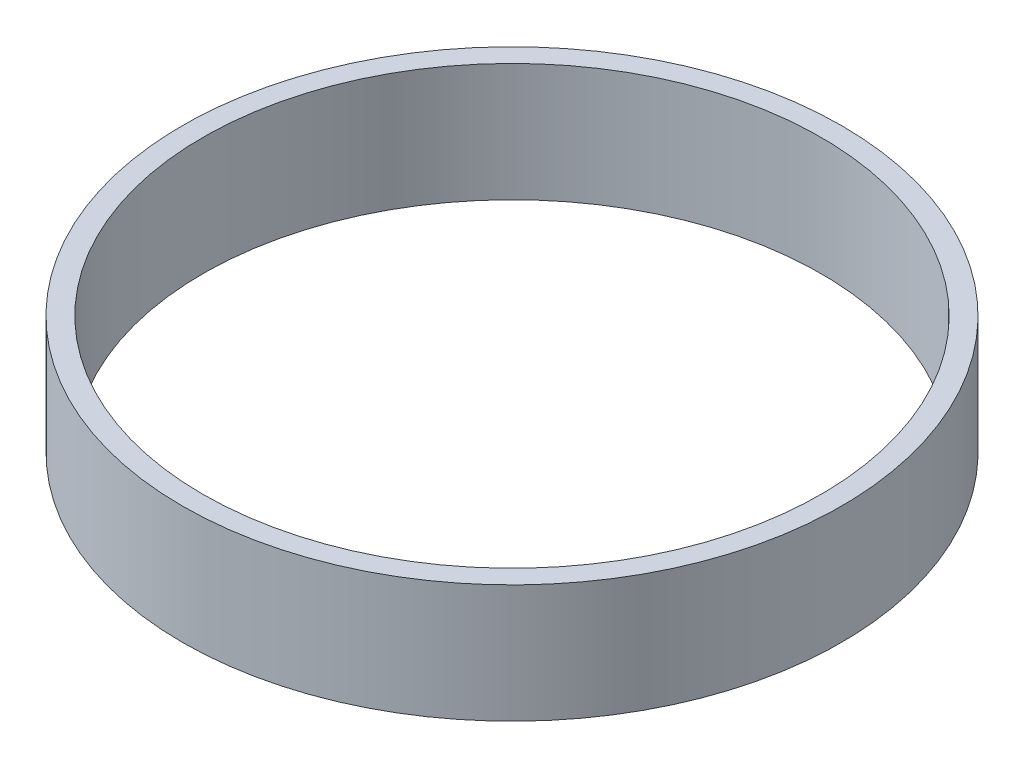
ISO-10303-21;
HEADER;
FILE_DESCRIPTION(('STEP AP214'),'2;1');
FILE_NAME('part.step','',(''),(''),'','','');
FILE_SCHEMA(('AUTOMOTIVE_DESIGN { 1 0 10303 214 1 1 1 1 }'));
ENDSEC;
DATA;
#1=APPLICATION_CONTEXT('core data for automotive mechanical design processes');
#2=APPLICATION_PROTOCOL_DEFINITION('international standard','automotive_design',2000,#1);
#3=PRODUCT_CONTEXT('',#1,'mechanical');
#4=PRODUCT('Part','Part','',(#3));
#5=PRODUCT_RELATED_PRODUCT_CATEGORY('part','',(#4));
#6=PRODUCT_DEFINITION_FORMATION('','',#4);
#7=PRODUCT_DEFINITION_CONTEXT('part definition',#1,'design');
#8=PRODUCT_DEFINITION('design','',#6,#7);
#9=PRODUCT_DEFINITION_SHAPE('','',#8);
#10=(LENGTH_UNIT() NAMED_UNIT(*) SI_UNIT(.MILLI.,.METRE.));
#11=(NAMED_UNIT(*) PLANE_ANGLE_UNIT() SI_UNIT($,.RADIAN.));
#12=(NAMED_UNIT(*) SI_UNIT($,.STERADIAN.) SOLID_ANGLE_UNIT());
#13=UNCERTAINTY_MEASURE_WITH_UNIT(LENGTH_MEASURE(1.E-05),#10,'distance_accuracy_value','');
#14=(GEOMETRIC_REPRESENTATION_CONTEXT(3) GLOBAL_UNCERTAINTY_ASSIGNED_CONTEXT((#13)) GLOBAL_UNIT_ASSIGNED_CONTEXT((#10,
#11,#12)) REPRESENTATION_CONTEXT('',''));
#15=CARTESIAN_POINT('',(0.,0.,0.));
#16=DIRECTION('',(0.,0.,1.));
#17=DIRECTION('',(1.,0.,0.));
#18=AXIS2_PLACEMENT_3D('',#15,#16,#17);
#19=CARTESIAN_POINT('',(0.,13.65,0.));
#20=DIRECTION('',(0.,1.,0.));
#21=DIRECTION('',(0.,0.,1.));
#22=AXIS2_PLACEMENT_3D('',#19,#20,#21);
#23=PLANE('',#22);
#24=CARTESIAN_POINT('',(0.,13.65,0.));
#25=DIRECTION('',(0.,1.,0.));
#26=DIRECTION('',(0.,0.,1.));
#27=AXIS2_PLACEMENT_3D('',#24,#25,#26);
#28=CIRCLE('',#27,38.1);
#29=CARTESIAN_POINT('',(0.,13.65,38.1));
#30=VERTEX_POINT('',#29);
#31=EDGE_CURVE('E10',#30,#30,#28,.T.);
#32=ORIENTED_EDGE('',*,*,#31,.T.);
#33=EDGE_LOOP('',(#32));
#34=FACE_BOUND('',#33,.T.);
#35=CARTESIAN_POINT('',(0.,13.65,0.));
#36=DIRECTION('',(0.,1.,0.));
#37=DIRECTION('',(0.,0.,1.));
#38=AXIS2_PLACEMENT_3D('',#35,#36,#37);
#39=CIRCLE('',#38,35.74);
#40=CARTESIAN_POINT('',(0.,13.65,35.74));
#41=VERTEX_POINT('',#40);
#42=EDGE_CURVE('E54',#41,#41,#39,.T.);
#43=ORIENTED_EDGE('',*,*,#42,.F.);
#44=EDGE_LOOP('',(#43));
#45=FACE_BOUND('',#44,.T.);
#46=ADVANCED_FACE('F41',(#34,#45),#23,.T.);
#47=CARTESIAN_POINT('',(0.,0.,0.));
#48=DIRECTION('',(0.,1.,0.));
#49=DIRECTION('',(0.,0.,1.));
#50=AXIS2_PLACEMENT_3D('',#47,#48,#49);
#51=PLANE('',#50);
#52=CARTESIAN_POINT('',(0.,0.,0.));
#53=DIRECTION('',(0.,1.,0.));
#54=DIRECTION('',(0.,0.,1.));
#55=AXIS2_PLACEMENT_3D('',#52,#53,#54);
#56=CIRCLE('',#55,38.1);
#57=CARTESIAN_POINT('',(0.,0.,38.1));
#58=VERTEX_POINT('',#57);
#59=EDGE_CURVE('E45',#58,#58,#56,.T.);
#60=ORIENTED_EDGE('',*,*,#59,.F.);
#61=EDGE_LOOP('',(#60));
#62=FACE_BOUND('',#61,.T.);
#63=CARTESIAN_POINT('',(0.,0.,0.));
#64=DIRECTION('',(0.,1.,0.));
#65=DIRECTION('',(0.,0.,1.));
#66=AXIS2_PLACEMENT_3D('',#63,#64,#65);
#67=CIRCLE('',#66,35.74);
#68=CARTESIAN_POINT('',(0.,0.,35.74));
#69=VERTEX_POINT('',#68);
#70=EDGE_CURVE('E56',#69,#69,#67,.T.);
#71=ORIENTED_EDGE('',*,*,#70,.T.);
#72=EDGE_LOOP('',(#71));
#73=FACE_BOUND('',#72,.T.);
#74=ADVANCED_FACE('F68',(#62,#73),#51,.F.);
#75=CARTESIAN_POINT('',(0.,13.65,0.));
#76=DIRECTION('',(0.,-1.,0.));
#77=DIRECTION('',(0.,0.,-1.));
#78=AXIS2_PLACEMENT_3D('',#75,#76,#77);
#79=CYLINDRICAL_SURFACE('',#78,38.1);
#80=ORIENTED_EDGE('',*,*,#31,.F.);
#81=EDGE_LOOP('',(#80));
#82=FACE_BOUND('',#81,.T.);
#83=ORIENTED_EDGE('',*,*,#59,.T.);
#84=EDGE_LOOP('',(#83));
#85=FACE_BOUND('',#84,.T.);
#86=ADVANCED_FACE('F43',(#82,#85),#79,.T.);
#87=CARTESIAN_POINT('',(0.,13.65,0.));
#88=DIRECTION('',(0.,-1.,0.));
#89=DIRECTION('',(0.,0.,-1.));
#90=AXIS2_PLACEMENT_3D('',#87,#88,#89);
#91=CYLINDRICAL_SURFACE('',#90,35.74);
#92=ORIENTED_EDGE('',*,*,#42,.T.);
#93=EDGE_LOOP('',(#92));
#94=FACE_BOUND('',#93,.T.);
#95=ORIENTED_EDGE('',*,*,#70,.F.);
#96=EDGE_LOOP('',(#95));
#97=FACE_BOUND('',#96,.T.);
#98=ADVANCED_FACE('F64',(#94,#97),#91,.F.);
#99=CLOSED_SHELL('',(#46,#74,#86,#98));
#100=MANIFOLD_SOLID_BREP('B2',#99);
#101=ADVANCED_BREP_SHAPE_REPRESENTATION('',(#18,#100),#14);
#102=SHAPE_DEFINITION_REPRESENTATION(#9,#101);
ENDSEC;
END-ISO-10303-21;
